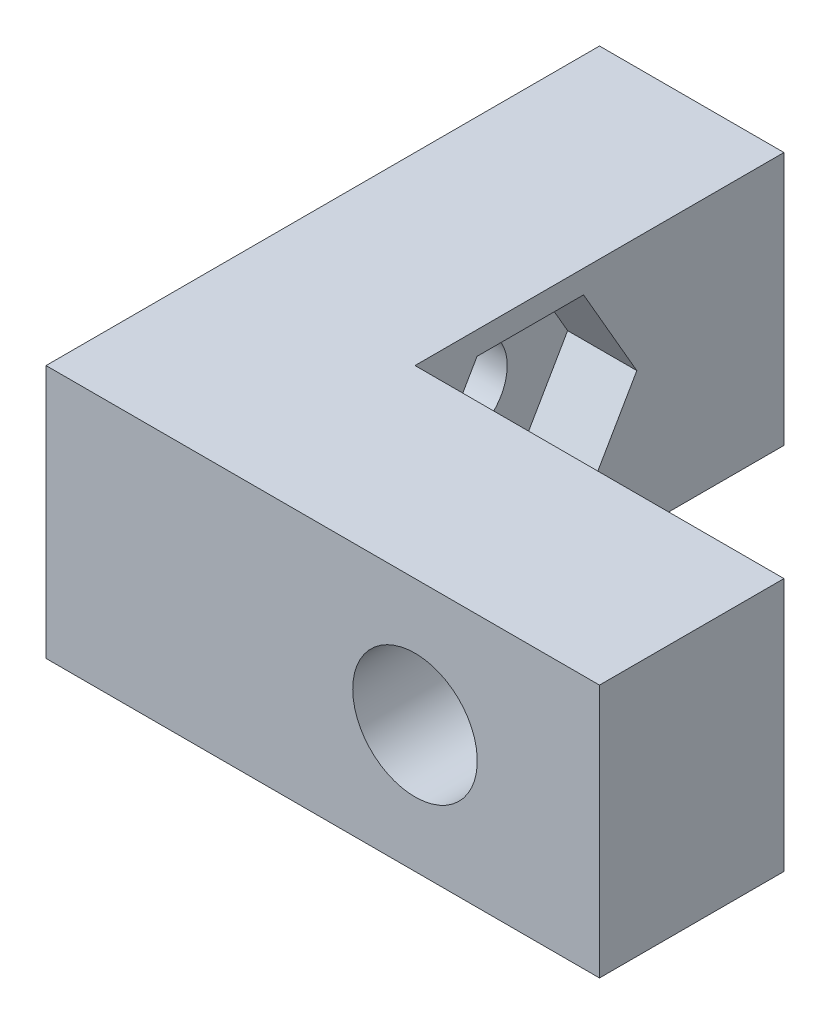
ISO-10303-21;
HEADER;
FILE_DESCRIPTION(('STEP AP214'),'2;1');
FILE_NAME('part.step','',(''),(''),'','','');
FILE_SCHEMA(('AUTOMOTIVE_DESIGN { 1 0 10303 214 1 1 1 1 }'));
ENDSEC;
DATA;
#1=APPLICATION_CONTEXT('core data for automotive mechanical design processes');
#2=APPLICATION_PROTOCOL_DEFINITION('international standard','automotive_design',2000,#1);
#3=PRODUCT_CONTEXT('',#1,'mechanical');
#4=PRODUCT('Part','Part','',(#3));
#5=PRODUCT_RELATED_PRODUCT_CATEGORY('part','',(#4));
#6=PRODUCT_DEFINITION_FORMATION('','',#4);
#7=PRODUCT_DEFINITION_CONTEXT('part definition',#1,'design');
#8=PRODUCT_DEFINITION('design','',#6,#7);
#9=PRODUCT_DEFINITION_SHAPE('','',#8);
#10=(LENGTH_UNIT() NAMED_UNIT(*) SI_UNIT(.MILLI.,.METRE.));
#11=(NAMED_UNIT(*) PLANE_ANGLE_UNIT() SI_UNIT($,.RADIAN.));
#12=(NAMED_UNIT(*) SI_UNIT($,.STERADIAN.) SOLID_ANGLE_UNIT());
#13=UNCERTAINTY_MEASURE_WITH_UNIT(LENGTH_MEASURE(1.E-05),#10,'distance_accuracy_value','');
#14=(GEOMETRIC_REPRESENTATION_CONTEXT(3) GLOBAL_UNCERTAINTY_ASSIGNED_CONTEXT((#13)) GLOBAL_UNIT_ASSIGNED_CONTEXT((#10,
#11,#12)) REPRESENTATION_CONTEXT('',''));
#15=CARTESIAN_POINT('',(0.,0.,0.));
#16=DIRECTION('',(0.,0.,1.));
#17=DIRECTION('',(1.,0.,0.));
#18=AXIS2_PLACEMENT_3D('',#15,#16,#17);
#19=CARTESIAN_POINT('',(12.001,3.,-6.5));
#20=DIRECTION('',(-1.,0.,0.));
#21=DIRECTION('',(0.,0.,1.));
#22=AXIS2_PLACEMENT_3D('',#19,#20,#21);
#23=CYLINDRICAL_SURFACE('',#22,1.);
#24=CARTESIAN_POINT('',(0.,3.,-6.5));
#25=DIRECTION('',(-1.,0.,0.));
#26=DIRECTION('',(0.,0.,1.));
#27=AXIS2_PLACEMENT_3D('',#24,#25,#26);
#28=CIRCLE('',#27,1.);
#29=CARTESIAN_POINT('',(0.,3.,-5.5));
#30=VERTEX_POINT('',#29);
#31=EDGE_CURVE('E137',#30,#30,#28,.T.);
#32=ORIENTED_EDGE('',*,*,#31,.T.);
#33=EDGE_LOOP('',(#32));
#34=FACE_BOUND('',#33,.T.);
#35=CARTESIAN_POINT('',(2.5,3.,-6.5));
#36=DIRECTION('',(1.,0.,0.));
#37=DIRECTION('',(0.,0.,-1.));
#38=AXIS2_PLACEMENT_3D('',#35,#36,#37);
#39=CIRCLE('',#38,1.);
#40=CARTESIAN_POINT('',(2.5,3.,-7.5));
#41=VERTEX_POINT('',#40);
#42=EDGE_CURVE('E39',#41,#41,#39,.F.);
#43=ORIENTED_EDGE('',*,*,#42,.F.);
#44=EDGE_LOOP('',(#43));
#45=FACE_BOUND('',#44,.T.);
#46=ADVANCED_FACE('F35',(#34,#45),#23,.F.);
#47=CARTESIAN_POINT('',(0.,5.5,-12.));
#48=DIRECTION('',(1.,0.,0.));
#49=DIRECTION('',(0.,0.,-1.));
#50=AXIS2_PLACEMENT_3D('',#47,#48,#49);
#51=PLANE('',#50);
#52=ORIENTED_EDGE('',*,*,#31,.F.);
#53=EDGE_LOOP('',(#52));
#54=FACE_BOUND('',#53,.T.);
#55=DIRECTION('',(0.,0.,1.));
#56=VECTOR('',#55,1.);
#57=CARTESIAN_POINT('',(0.,0.,-12.));
#58=LINE('',#57,#56);
#59=CARTESIAN_POINT('',(0.,0.,-12.));
#60=VERTEX_POINT('',#59);
#61=CARTESIAN_POINT('',(0.,0.,0.));
#62=VERTEX_POINT('',#61);
#63=EDGE_CURVE('E133',#60,#62,#58,.T.);
#64=ORIENTED_EDGE('',*,*,#63,.T.);
#65=DIRECTION('',(0.,-1.,0.));
#66=VECTOR('',#65,1.);
#67=CARTESIAN_POINT('',(0.,5.5,0.));
#68=LINE('',#67,#66);
#69=CARTESIAN_POINT('',(0.,5.5,0.));
#70=VERTEX_POINT('',#69);
#71=EDGE_CURVE('E11',#70,#62,#68,.T.);
#72=ORIENTED_EDGE('',*,*,#71,.F.);
#73=DIRECTION('',(0.,0.,1.));
#74=VECTOR('',#73,1.);
#75=CARTESIAN_POINT('',(0.,5.5,-12.));
#76=LINE('',#75,#74);
#77=CARTESIAN_POINT('',(0.,5.5,-12.));
#78=VERTEX_POINT('',#77);
#79=EDGE_CURVE('E145',#78,#70,#76,.T.);
#80=ORIENTED_EDGE('',*,*,#79,.F.);
#81=DIRECTION('',(0.,-1.,0.));
#82=VECTOR('',#81,1.);
#83=CARTESIAN_POINT('',(0.,5.5,-12.));
#84=LINE('',#83,#82);
#85=EDGE_CURVE('E129',#78,#60,#84,.T.);
#86=ORIENTED_EDGE('',*,*,#85,.T.);
#87=EDGE_LOOP('',(#64,#72,#80,#86));
#88=FACE_BOUND('',#87,.T.);
#89=ADVANCED_FACE('F37',(#54,#88),#51,.F.);
#90=CARTESIAN_POINT('',(0.,5.5,0.));
#91=DIRECTION('',(0.,0.,-1.));
#92=DIRECTION('',(-1.,0.,0.));
#93=AXIS2_PLACEMENT_3D('',#90,#91,#92);
#94=PLANE('',#93);
#95=CARTESIAN_POINT('',(8.,2.75,0.));
#96=DIRECTION('',(0.,0.,-1.));
#97=DIRECTION('',(-1.,0.,0.));
#98=AXIS2_PLACEMENT_3D('',#95,#96,#97);
#99=CIRCLE('',#98,1.35);
#100=CARTESIAN_POINT('',(6.65,2.75,0.));
#101=VERTEX_POINT('',#100);
#102=EDGE_CURVE('E199',#101,#101,#99,.F.);
#103=ORIENTED_EDGE('',*,*,#102,.F.);
#104=EDGE_LOOP('',(#103));
#105=FACE_BOUND('',#104,.T.);
#106=DIRECTION('',(1.,0.,0.));
#107=VECTOR('',#106,1.);
#108=CARTESIAN_POINT('',(0.,0.,0.));
#109=LINE('',#108,#107);
#110=CARTESIAN_POINT('',(12.,0.,0.));
#111=VERTEX_POINT('',#110);
#112=EDGE_CURVE('E136',#62,#111,#109,.T.);
#113=ORIENTED_EDGE('',*,*,#112,.T.);
#114=DIRECTION('',(0.,-1.,0.));
#115=VECTOR('',#114,1.);
#116=CARTESIAN_POINT('',(12.,5.5,0.));
#117=LINE('',#116,#115);
#118=CARTESIAN_POINT('',(12.,5.5,0.));
#119=VERTEX_POINT('',#118);
#120=EDGE_CURVE('E44',#119,#111,#117,.T.);
#121=ORIENTED_EDGE('',*,*,#120,.F.);
#122=DIRECTION('',(1.,0.,0.));
#123=VECTOR('',#122,1.);
#124=CARTESIAN_POINT('',(0.,5.5,0.));
#125=LINE('',#124,#123);
#126=EDGE_CURVE('E95',#70,#119,#125,.T.);
#127=ORIENTED_EDGE('',*,*,#126,.F.);
#128=ORIENTED_EDGE('',*,*,#71,.T.);
#129=EDGE_LOOP('',(#113,#121,#127,#128));
#130=FACE_BOUND('',#129,.T.);
#131=ADVANCED_FACE('F233',(#105,#130),#94,.F.);
#132=CARTESIAN_POINT('',(12.,5.5,0.));
#133=DIRECTION('',(-1.,0.,0.));
#134=DIRECTION('',(0.,0.,1.));
#135=AXIS2_PLACEMENT_3D('',#132,#133,#134);
#136=PLANE('',#135);
#137=DIRECTION('',(0.,0.,-1.));
#138=VECTOR('',#137,1.);
#139=CARTESIAN_POINT('',(12.,0.,0.));
#140=LINE('',#139,#138);
#141=CARTESIAN_POINT('',(12.,0.,-4.));
#142=VERTEX_POINT('',#141);
#143=EDGE_CURVE('E139',#111,#142,#140,.T.);
#144=ORIENTED_EDGE('',*,*,#143,.T.);
#145=DIRECTION('',(0.,-1.,0.));
#146=VECTOR('',#145,1.);
#147=CARTESIAN_POINT('',(12.,5.5,-4.));
#148=LINE('',#147,#146);
#149=CARTESIAN_POINT('',(12.,5.5,-4.));
#150=VERTEX_POINT('',#149);
#151=EDGE_CURVE('E124',#150,#142,#148,.T.);
#152=ORIENTED_EDGE('',*,*,#151,.F.);
#153=DIRECTION('',(0.,0.,-1.));
#154=VECTOR('',#153,1.);
#155=CARTESIAN_POINT('',(12.,5.5,0.));
#156=LINE('',#155,#154);
#157=EDGE_CURVE('E112',#119,#150,#156,.T.);
#158=ORIENTED_EDGE('',*,*,#157,.F.);
#159=ORIENTED_EDGE('',*,*,#120,.T.);
#160=EDGE_LOOP('',(#144,#152,#158,#159));
#161=FACE_BOUND('',#160,.T.);
#162=ADVANCED_FACE('F152',(#161),#136,.F.);
#163=CARTESIAN_POINT('',(12.,5.5,-4.));
#164=DIRECTION('',(0.,0.,1.));
#165=DIRECTION('',(1.,0.,0.));
#166=AXIS2_PLACEMENT_3D('',#163,#164,#165);
#167=PLANE('',#166);
#168=CARTESIAN_POINT('',(8.,2.75,-4.));
#169=DIRECTION('',(0.,0.,-1.));
#170=DIRECTION('',(-1.,0.,0.));
#171=AXIS2_PLACEMENT_3D('',#168,#169,#170);
#172=CIRCLE('',#171,1.35);
#173=CARTESIAN_POINT('',(6.65,2.75,-4.));
#174=VERTEX_POINT('',#173);
#175=EDGE_CURVE('E218',#174,#174,#172,.T.);
#176=ORIENTED_EDGE('',*,*,#175,.F.);
#177=EDGE_LOOP('',(#176));
#178=FACE_BOUND('',#177,.T.);
#179=DIRECTION('',(-1.,0.,0.));
#180=VECTOR('',#179,1.);
#181=CARTESIAN_POINT('',(12.,0.,-4.));
#182=LINE('',#181,#180);
#183=CARTESIAN_POINT('',(4.,0.,-4.));
#184=VERTEX_POINT('',#183);
#185=EDGE_CURVE('E121',#142,#184,#182,.T.);
#186=ORIENTED_EDGE('',*,*,#185,.T.);
#187=DIRECTION('',(0.,-1.,0.));
#188=VECTOR('',#187,1.);
#189=CARTESIAN_POINT('',(4.,5.5,-4.));
#190=LINE('',#189,#188);
#191=CARTESIAN_POINT('',(4.,5.5,-4.));
#192=VERTEX_POINT('',#191);
#193=EDGE_CURVE('E118',#192,#184,#190,.T.);
#194=ORIENTED_EDGE('',*,*,#193,.F.);
#195=DIRECTION('',(-1.,0.,0.));
#196=VECTOR('',#195,1.);
#197=CARTESIAN_POINT('',(12.,5.5,-4.));
#198=LINE('',#197,#196);
#199=EDGE_CURVE('E105',#150,#192,#198,.T.);
#200=ORIENTED_EDGE('',*,*,#199,.F.);
#201=ORIENTED_EDGE('',*,*,#151,.T.);
#202=EDGE_LOOP('',(#186,#194,#200,#201));
#203=FACE_BOUND('',#202,.T.);
#204=ADVANCED_FACE('F119',(#178,#203),#167,.F.);
#205=CARTESIAN_POINT('',(4.,5.5,-4.));
#206=DIRECTION('',(-1.,0.,0.));
#207=DIRECTION('',(0.,0.,1.));
#208=AXIS2_PLACEMENT_3D('',#205,#206,#207);
#209=PLANE('',#208);
#210=DIRECTION('',(0.,0.866025403784438,0.5));
#211=VECTOR('',#210,1.);
#212=CARTESIAN_POINT('',(4.,3.,-8.8094010767585));
#213=LINE('',#212,#211);
#214=CARTESIAN_POINT('',(4.,3.,-8.8094010767585));
#215=VERTEX_POINT('',#214);
#216=CARTESIAN_POINT('',(4.,5.,-7.65470053837925));
#217=VERTEX_POINT('',#216);
#218=EDGE_CURVE('E195',#215,#217,#213,.T.);
#219=ORIENTED_EDGE('',*,*,#218,.F.);
#220=DIRECTION('',(0.,0.866025403784438,-0.500000000000001));
#221=VECTOR('',#220,1.);
#222=CARTESIAN_POINT('',(4.,0.999999999999998,-7.65470053837925));
#223=LINE('',#222,#221);
#224=CARTESIAN_POINT('',(4.,0.999999999999998,-7.65470053837925));
#225=VERTEX_POINT('',#224);
#226=EDGE_CURVE('E51',#225,#215,#223,.T.);
#227=ORIENTED_EDGE('',*,*,#226,.F.);
#228=DIRECTION('',(0.,0.,-1.));
#229=VECTOR('',#228,1.);
#230=CARTESIAN_POINT('',(4.,0.999999999999998,-5.34529946162075));
#231=LINE('',#230,#229);
#232=CARTESIAN_POINT('',(4.,0.999999999999998,-5.34529946162075));
#233=VERTEX_POINT('',#232);
#234=EDGE_CURVE('E182',#233,#225,#231,.T.);
#235=ORIENTED_EDGE('',*,*,#234,.F.);
#236=DIRECTION('',(0.,-0.866025403784439,-0.5));
#237=VECTOR('',#236,1.);
#238=CARTESIAN_POINT('',(4.,3.,-4.1905989232415));
#239=LINE('',#238,#237);
#240=CARTESIAN_POINT('',(4.,3.,-4.1905989232415));
#241=VERTEX_POINT('',#240);
#242=EDGE_CURVE('E186',#241,#233,#239,.T.);
#243=ORIENTED_EDGE('',*,*,#242,.F.);
#244=DIRECTION('',(0.,-0.866025403784439,0.5));
#245=VECTOR('',#244,1.);
#246=CARTESIAN_POINT('',(4.,5.,-5.34529946162075));
#247=LINE('',#246,#245);
#248=CARTESIAN_POINT('',(4.,5.,-5.34529946162075));
#249=VERTEX_POINT('',#248);
#250=EDGE_CURVE('E189',#249,#241,#247,.T.);
#251=ORIENTED_EDGE('',*,*,#250,.F.);
#252=DIRECTION('',(0.,0.,1.));
#253=VECTOR('',#252,1.);
#254=CARTESIAN_POINT('',(4.,5.,-7.65470053837925));
#255=LINE('',#254,#253);
#256=EDGE_CURVE('E192',#217,#249,#255,.T.);
#257=ORIENTED_EDGE('',*,*,#256,.F.);
#258=EDGE_LOOP('',(#219,#227,#235,#243,#251,#257));
#259=FACE_BOUND('',#258,.T.);
#260=DIRECTION('',(0.,0.,-1.));
#261=VECTOR('',#260,1.);
#262=CARTESIAN_POINT('',(4.,0.,-4.));
#263=LINE('',#262,#261);
#264=CARTESIAN_POINT('',(4.,0.,-12.));
#265=VERTEX_POINT('',#264);
#266=EDGE_CURVE('E142',#184,#265,#263,.T.);
#267=ORIENTED_EDGE('',*,*,#266,.T.);
#268=DIRECTION('',(0.,-1.,0.));
#269=VECTOR('',#268,1.);
#270=CARTESIAN_POINT('',(4.,5.5,-12.));
#271=LINE('',#270,#269);
#272=CARTESIAN_POINT('',(4.,5.5,-12.));
#273=VERTEX_POINT('',#272);
#274=EDGE_CURVE('E125',#273,#265,#271,.T.);
#275=ORIENTED_EDGE('',*,*,#274,.F.);
#276=DIRECTION('',(0.,0.,-1.));
#277=VECTOR('',#276,1.);
#278=CARTESIAN_POINT('',(4.,5.5,-4.));
#279=LINE('',#278,#277);
#280=EDGE_CURVE('E109',#192,#273,#279,.T.);
#281=ORIENTED_EDGE('',*,*,#280,.F.);
#282=ORIENTED_EDGE('',*,*,#193,.T.);
#283=EDGE_LOOP('',(#267,#275,#281,#282));
#284=FACE_BOUND('',#283,.T.);
#285=ADVANCED_FACE('F127',(#259,#284),#209,.F.);
#286=CARTESIAN_POINT('',(4.,5.5,-12.));
#287=DIRECTION('',(0.,0.,1.));
#288=DIRECTION('',(1.,0.,0.));
#289=AXIS2_PLACEMENT_3D('',#286,#287,#288);
#290=PLANE('',#289);
#291=DIRECTION('',(-1.,0.,0.));
#292=VECTOR('',#291,1.);
#293=CARTESIAN_POINT('',(4.,0.,-12.));
#294=LINE('',#293,#292);
#295=EDGE_CURVE('E87',#265,#60,#294,.T.);
#296=ORIENTED_EDGE('',*,*,#295,.T.);
#297=ORIENTED_EDGE('',*,*,#85,.F.);
#298=DIRECTION('',(-1.,0.,0.));
#299=VECTOR('',#298,1.);
#300=CARTESIAN_POINT('',(4.,5.5,-12.));
#301=LINE('',#300,#299);
#302=EDGE_CURVE('E60',#273,#78,#301,.T.);
#303=ORIENTED_EDGE('',*,*,#302,.F.);
#304=ORIENTED_EDGE('',*,*,#274,.T.);
#305=EDGE_LOOP('',(#296,#297,#303,#304));
#306=FACE_BOUND('',#305,.T.);
#307=ADVANCED_FACE('F156',(#306),#290,.F.);
#308=CARTESIAN_POINT('',(0.,5.5,0.));
#309=DIRECTION('',(0.,1.,0.));
#310=DIRECTION('',(0.,0.,1.));
#311=AXIS2_PLACEMENT_3D('',#308,#309,#310);
#312=PLANE('',#311);
#313=ORIENTED_EDGE('',*,*,#79,.T.);
#314=ORIENTED_EDGE('',*,*,#126,.T.);
#315=ORIENTED_EDGE('',*,*,#157,.T.);
#316=ORIENTED_EDGE('',*,*,#199,.T.);
#317=ORIENTED_EDGE('',*,*,#280,.T.);
#318=ORIENTED_EDGE('',*,*,#302,.T.);
#319=EDGE_LOOP('',(#313,#314,#315,#316,#317,#318));
#320=FACE_BOUND('',#319,.T.);
#321=ADVANCED_FACE('F107',(#320),#312,.T.);
#322=CARTESIAN_POINT('',(0.,0.,0.));
#323=DIRECTION('',(0.,1.,0.));
#324=DIRECTION('',(0.,0.,1.));
#325=AXIS2_PLACEMENT_3D('',#322,#323,#324);
#326=PLANE('',#325);
#327=ORIENTED_EDGE('',*,*,#63,.F.);
#328=ORIENTED_EDGE('',*,*,#295,.F.);
#329=ORIENTED_EDGE('',*,*,#266,.F.);
#330=ORIENTED_EDGE('',*,*,#185,.F.);
#331=ORIENTED_EDGE('',*,*,#143,.F.);
#332=ORIENTED_EDGE('',*,*,#112,.F.);
#333=EDGE_LOOP('',(#327,#328,#329,#330,#331,#332));
#334=FACE_BOUND('',#333,.T.);
#335=ADVANCED_FACE('F155',(#334),#326,.F.);
#336=CARTESIAN_POINT('',(2.5,0.,0.));
#337=DIRECTION('',(1.,0.,0.));
#338=DIRECTION('',(0.,0.,-1.));
#339=AXIS2_PLACEMENT_3D('',#336,#337,#338);
#340=PLANE('',#339);
#341=DIRECTION('',(0.,0.866025403784438,-0.500000000000001));
#342=VECTOR('',#341,1.);
#343=CARTESIAN_POINT('',(2.5,0.999999999999998,-7.65470053837925));
#344=LINE('',#343,#342);
#345=CARTESIAN_POINT('',(2.5,0.999999999999998,-7.65470053837925));
#346=VERTEX_POINT('',#345);
#347=CARTESIAN_POINT('',(2.5,3.,-8.8094010767585));
#348=VERTEX_POINT('',#347);
#349=EDGE_CURVE('E185',#346,#348,#344,.T.);
#350=ORIENTED_EDGE('',*,*,#349,.T.);
#351=DIRECTION('',(0.,0.866025403784438,0.5));
#352=VECTOR('',#351,1.);
#353=CARTESIAN_POINT('',(2.5,3.,-8.8094010767585));
#354=LINE('',#353,#352);
#355=CARTESIAN_POINT('',(2.5,5.,-7.65470053837925));
#356=VERTEX_POINT('',#355);
#357=EDGE_CURVE('E211',#348,#356,#354,.T.);
#358=ORIENTED_EDGE('',*,*,#357,.T.);
#359=DIRECTION('',(0.,0.,1.));
#360=VECTOR('',#359,1.);
#361=CARTESIAN_POINT('',(2.5,5.,-7.65470053837925));
#362=LINE('',#361,#360);
#363=CARTESIAN_POINT('',(2.5,5.,-5.34529946162075));
#364=VERTEX_POINT('',#363);
#365=EDGE_CURVE('E208',#356,#364,#362,.T.);
#366=ORIENTED_EDGE('',*,*,#365,.T.);
#367=DIRECTION('',(0.,-0.866025403784439,0.5));
#368=VECTOR('',#367,1.);
#369=CARTESIAN_POINT('',(2.5,5.,-5.34529946162075));
#370=LINE('',#369,#368);
#371=CARTESIAN_POINT('',(2.5,3.,-4.1905989232415));
#372=VERTEX_POINT('',#371);
#373=EDGE_CURVE('E205',#364,#372,#370,.T.);
#374=ORIENTED_EDGE('',*,*,#373,.T.);
#375=DIRECTION('',(0.,-0.866025403784439,-0.5));
#376=VECTOR('',#375,1.);
#377=CARTESIAN_POINT('',(2.5,3.,-4.1905989232415));
#378=LINE('',#377,#376);
#379=CARTESIAN_POINT('',(2.5,0.999999999999998,-5.34529946162075));
#380=VERTEX_POINT('',#379);
#381=EDGE_CURVE('E202',#372,#380,#378,.T.);
#382=ORIENTED_EDGE('',*,*,#381,.T.);
#383=DIRECTION('',(0.,0.,-1.));
#384=VECTOR('',#383,1.);
#385=CARTESIAN_POINT('',(2.5,0.999999999999998,-5.34529946162075));
#386=LINE('',#385,#384);
#387=EDGE_CURVE('E168',#380,#346,#386,.T.);
#388=ORIENTED_EDGE('',*,*,#387,.T.);
#389=EDGE_LOOP('',(#350,#358,#366,#374,#382,#388));
#390=FACE_BOUND('',#389,.T.);
#391=ORIENTED_EDGE('',*,*,#42,.T.);
#392=EDGE_LOOP('',(#391));
#393=FACE_BOUND('',#392,.T.);
#394=ADVANCED_FACE('F251',(#390,#393),#340,.T.);
#395=CARTESIAN_POINT('',(2.5,0.999999999999998,-7.65470053837925));
#396=DIRECTION('',(0.,-0.5,-0.866025403784438));
#397=DIRECTION('',(0.,0.866025403784438,-0.500000000000001));
#398=AXIS2_PLACEMENT_3D('',#395,#396,#397);
#399=PLANE('',#398);
#400=ORIENTED_EDGE('',*,*,#226,.T.);
#401=DIRECTION('',(1.,0.,0.));
#402=VECTOR('',#401,1.);
#403=CARTESIAN_POINT('',(2.5,3.,-8.8094010767585));
#404=LINE('',#403,#402);
#405=EDGE_CURVE('E165',#348,#215,#404,.T.);
#406=ORIENTED_EDGE('',*,*,#405,.F.);
#407=ORIENTED_EDGE('',*,*,#349,.F.);
#408=DIRECTION('',(1.,0.,0.));
#409=VECTOR('',#408,1.);
#410=CARTESIAN_POINT('',(2.5,0.999999999999998,-7.65470053837925));
#411=LINE('',#410,#409);
#412=EDGE_CURVE('E180',#346,#225,#411,.T.);
#413=ORIENTED_EDGE('',*,*,#412,.T.);
#414=EDGE_LOOP('',(#400,#406,#407,#413));
#415=FACE_BOUND('',#414,.T.);
#416=ADVANCED_FACE('F245',(#415),#399,.F.);
#417=CARTESIAN_POINT('',(2.5,0.999999999999998,-5.34529946162075));
#418=DIRECTION('',(0.,-1.,0.));
#419=DIRECTION('',(0.,0.,-1.));
#420=AXIS2_PLACEMENT_3D('',#417,#418,#419);
#421=PLANE('',#420);
#422=ORIENTED_EDGE('',*,*,#234,.T.);
#423=ORIENTED_EDGE('',*,*,#412,.F.);
#424=ORIENTED_EDGE('',*,*,#387,.F.);
#425=DIRECTION('',(1.,0.,0.));
#426=VECTOR('',#425,1.);
#427=CARTESIAN_POINT('',(2.5,0.999999999999998,-5.34529946162075));
#428=LINE('',#427,#426);
#429=EDGE_CURVE('E177',#380,#233,#428,.T.);
#430=ORIENTED_EDGE('',*,*,#429,.T.);
#431=EDGE_LOOP('',(#422,#423,#424,#430));
#432=FACE_BOUND('',#431,.T.);
#433=ADVANCED_FACE('F280',(#432),#421,.F.);
#434=CARTESIAN_POINT('',(2.5,3.,-4.1905989232415));
#435=DIRECTION('',(0.,-0.5,0.866025403784439));
#436=DIRECTION('',(0.,-0.866025403784439,-0.5));
#437=AXIS2_PLACEMENT_3D('',#434,#435,#436);
#438=PLANE('',#437);
#439=ORIENTED_EDGE('',*,*,#242,.T.);
#440=ORIENTED_EDGE('',*,*,#429,.F.);
#441=ORIENTED_EDGE('',*,*,#381,.F.);
#442=DIRECTION('',(1.,0.,0.));
#443=VECTOR('',#442,1.);
#444=CARTESIAN_POINT('',(2.5,3.,-4.1905989232415));
#445=LINE('',#444,#443);
#446=EDGE_CURVE('E174',#372,#241,#445,.T.);
#447=ORIENTED_EDGE('',*,*,#446,.T.);
#448=EDGE_LOOP('',(#439,#440,#441,#447));
#449=FACE_BOUND('',#448,.T.);
#450=ADVANCED_FACE('F286',(#449),#438,.F.);
#451=CARTESIAN_POINT('',(2.5,5.,-5.34529946162075));
#452=DIRECTION('',(0.,0.5,0.866025403784439));
#453=DIRECTION('',(0.,-0.866025403784439,0.5));
#454=AXIS2_PLACEMENT_3D('',#451,#452,#453);
#455=PLANE('',#454);
#456=ORIENTED_EDGE('',*,*,#250,.T.);
#457=ORIENTED_EDGE('',*,*,#446,.F.);
#458=ORIENTED_EDGE('',*,*,#373,.F.);
#459=DIRECTION('',(1.,0.,0.));
#460=VECTOR('',#459,1.);
#461=CARTESIAN_POINT('',(2.5,5.,-5.34529946162075));
#462=LINE('',#461,#460);
#463=EDGE_CURVE('E171',#364,#249,#462,.T.);
#464=ORIENTED_EDGE('',*,*,#463,.T.);
#465=EDGE_LOOP('',(#456,#457,#458,#464));
#466=FACE_BOUND('',#465,.T.);
#467=ADVANCED_FACE('F294',(#466),#455,.F.);
#468=CARTESIAN_POINT('',(2.5,5.,-7.65470053837925));
#469=DIRECTION('',(0.,1.,0.));
#470=DIRECTION('',(0.,0.,1.));
#471=AXIS2_PLACEMENT_3D('',#468,#469,#470);
#472=PLANE('',#471);
#473=ORIENTED_EDGE('',*,*,#256,.T.);
#474=ORIENTED_EDGE('',*,*,#463,.F.);
#475=ORIENTED_EDGE('',*,*,#365,.F.);
#476=DIRECTION('',(1.,0.,0.));
#477=VECTOR('',#476,1.);
#478=CARTESIAN_POINT('',(2.5,5.,-7.65470053837925));
#479=LINE('',#478,#477);
#480=EDGE_CURVE('E167',#356,#217,#479,.T.);
#481=ORIENTED_EDGE('',*,*,#480,.T.);
#482=EDGE_LOOP('',(#473,#474,#475,#481));
#483=FACE_BOUND('',#482,.T.);
#484=ADVANCED_FACE('F302',(#483),#472,.F.);
#485=CARTESIAN_POINT('',(2.5,3.,-8.8094010767585));
#486=DIRECTION('',(0.,0.5,-0.866025403784439));
#487=DIRECTION('',(0.,0.866025403784439,0.5));
#488=AXIS2_PLACEMENT_3D('',#485,#486,#487);
#489=PLANE('',#488);
#490=ORIENTED_EDGE('',*,*,#218,.T.);
#491=ORIENTED_EDGE('',*,*,#480,.F.);
#492=ORIENTED_EDGE('',*,*,#357,.F.);
#493=ORIENTED_EDGE('',*,*,#405,.T.);
#494=EDGE_LOOP('',(#490,#491,#492,#493));
#495=FACE_BOUND('',#494,.T.);
#496=ADVANCED_FACE('F310',(#495),#489,.F.);
#497=CARTESIAN_POINT('',(8.,2.75,0.001000000000001));
#498=DIRECTION('',(0.,0.,-1.));
#499=DIRECTION('',(-1.,0.,0.));
#500=AXIS2_PLACEMENT_3D('',#497,#498,#499);
#501=CYLINDRICAL_SURFACE('',#500,1.35);
#502=ORIENTED_EDGE('',*,*,#175,.T.);
#503=EDGE_LOOP('',(#502));
#504=FACE_BOUND('',#503,.T.);
#505=ORIENTED_EDGE('',*,*,#102,.T.);
#506=EDGE_LOOP('',(#505));
#507=FACE_BOUND('',#506,.T.);
#508=ADVANCED_FACE('F222',(#504,#507),#501,.F.);
#509=CLOSED_SHELL('',(#46,#89,#131,#162,#204,#285,#307,#321,#335,#394,#416,#433,#450,#467,#484,
#496,#508));
#510=MANIFOLD_SOLID_BREP('B2',#509);
#511=ADVANCED_BREP_SHAPE_REPRESENTATION('',(#18,#510),#14);
#512=SHAPE_DEFINITION_REPRESENTATION(#9,#511);
ENDSEC;
END-ISO-10303-21;
